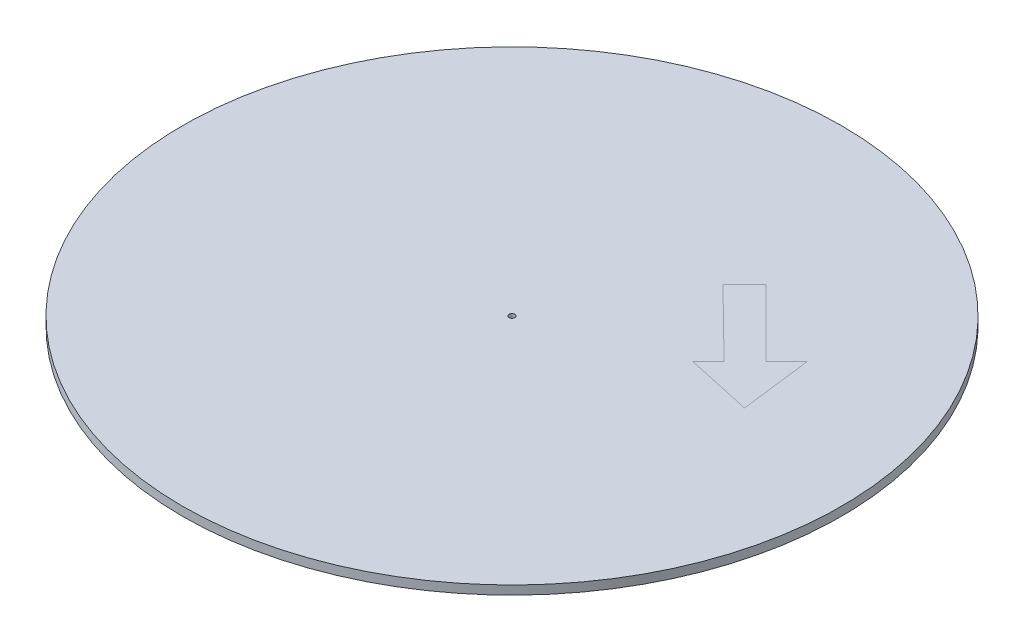
ISO-10303-21;
HEADER;
FILE_DESCRIPTION(('STEP AP214'),'2;1');
FILE_NAME('part.step','',(''),(''),'','','');
FILE_SCHEMA(('AUTOMOTIVE_DESIGN { 1 0 10303 214 1 1 1 1 }'));
ENDSEC;
DATA;
#1=APPLICATION_CONTEXT('core data for automotive mechanical design processes');
#2=APPLICATION_PROTOCOL_DEFINITION('international standard','automotive_design',2000,#1);
#3=PRODUCT_CONTEXT('',#1,'mechanical');
#4=PRODUCT('Part','Part','',(#3));
#5=PRODUCT_RELATED_PRODUCT_CATEGORY('part','',(#4));
#6=PRODUCT_DEFINITION_FORMATION('','',#4);
#7=PRODUCT_DEFINITION_CONTEXT('part definition',#1,'design');
#8=PRODUCT_DEFINITION('design','',#6,#7);
#9=PRODUCT_DEFINITION_SHAPE('','',#8);
#10=(LENGTH_UNIT() NAMED_UNIT(*) SI_UNIT(.MILLI.,.METRE.));
#11=(NAMED_UNIT(*) PLANE_ANGLE_UNIT() SI_UNIT($,.RADIAN.));
#12=(NAMED_UNIT(*) SI_UNIT($,.STERADIAN.) SOLID_ANGLE_UNIT());
#13=UNCERTAINTY_MEASURE_WITH_UNIT(LENGTH_MEASURE(1.E-05),#10,'distance_accuracy_value','');
#14=(GEOMETRIC_REPRESENTATION_CONTEXT(3) GLOBAL_UNCERTAINTY_ASSIGNED_CONTEXT((#13)) GLOBAL_UNIT_ASSIGNED_CONTEXT((#10,
#11,#12)) REPRESENTATION_CONTEXT('',''));
#15=CARTESIAN_POINT('',(0.,0.,0.));
#16=DIRECTION('',(0.,0.,1.));
#17=DIRECTION('',(1.,0.,0.));
#18=AXIS2_PLACEMENT_3D('',#15,#16,#17);
#19=CARTESIAN_POINT('',(0.,3.,0.));
#20=DIRECTION('',(0.,-1.,0.));
#21=DIRECTION('',(0.,0.,-1.));
#22=AXIS2_PLACEMENT_3D('',#19,#20,#21);
#23=CYLINDRICAL_SURFACE('',#22,112.5);
#24=CARTESIAN_POINT('',(0.,3.,0.));
#25=DIRECTION('',(0.,1.,0.));
#26=DIRECTION('',(0.,0.,1.));
#27=AXIS2_PLACEMENT_3D('',#24,#25,#26);
#28=CIRCLE('',#27,112.5);
#29=CARTESIAN_POINT('',(0.,3.,112.5));
#30=VERTEX_POINT('',#29);
#31=EDGE_CURVE('E11',#30,#30,#28,.T.);
#32=ORIENTED_EDGE('',*,*,#31,.F.);
#33=EDGE_LOOP('',(#32));
#34=FACE_BOUND('',#33,.T.);
#35=CARTESIAN_POINT('',(0.,0.,0.));
#36=DIRECTION('',(0.,1.,0.));
#37=DIRECTION('',(0.,0.,1.));
#38=AXIS2_PLACEMENT_3D('',#35,#36,#37);
#39=CIRCLE('',#38,112.5);
#40=CARTESIAN_POINT('',(0.,0.,112.5));
#41=VERTEX_POINT('',#40);
#42=EDGE_CURVE('E44',#41,#41,#39,.T.);
#43=ORIENTED_EDGE('',*,*,#42,.T.);
#44=EDGE_LOOP('',(#43));
#45=FACE_BOUND('',#44,.T.);
#46=ADVANCED_FACE('F41',(#34,#45),#23,.T.);
#47=CARTESIAN_POINT('',(0.,3.,0.));
#48=DIRECTION('',(0.,1.,0.));
#49=DIRECTION('',(0.,0.,1.));
#50=AXIS2_PLACEMENT_3D('',#47,#48,#49);
#51=PLANE('',#50);
#52=DIRECTION('',(0.713052521380195,0.,0.701110620197231));
#53=VECTOR('',#52,1.);
#54=CARTESIAN_POINT('',(49.612104378925,3.,-22.7841036337028));
#55=LINE('',#54,#53);
#56=CARTESIAN_POINT('',(26.6711118519753,3.,-45.3408901483581));
#57=VERTEX_POINT('',#56);
#58=CARTESIAN_POINT('',(49.612104378925,3.,-22.7841036337028));
#59=VERTEX_POINT('',#58);
#60=EDGE_CURVE('E55',#57,#59,#55,.T.);
#61=ORIENTED_EDGE('',*,*,#60,.F.);
#62=DIRECTION('',(-0.707106781186547,0.,0.707106781186549));
#63=VECTOR('',#62,1.);
#64=CARTESIAN_POINT('',(26.6711118519753,3.,-45.3408901483581));
#65=LINE('',#64,#63);
#66=CARTESIAN_POINT('',(34.0448898345803,3.,-52.714668130963));
#67=VERTEX_POINT('',#66);
#68=EDGE_CURVE('E147',#67,#57,#65,.T.);
#69=ORIENTED_EDGE('',*,*,#68,.F.);
#70=DIRECTION('',(-0.707106781186548,0.,-0.707106781186546));
#71=VECTOR('',#70,1.);
#72=CARTESIAN_POINT('',(34.0448898345803,3.,-52.714668130963));
#73=LINE('',#72,#71);
#74=CARTESIAN_POINT('',(56.7937793553828,3.,-29.9657786101606));
#75=VERTEX_POINT('',#74);
#76=EDGE_CURVE('E145',#75,#67,#73,.T.);
#77=ORIENTED_EDGE('',*,*,#76,.F.);
#78=DIRECTION('',(-0.707106781186547,0.,0.707106781186548));
#79=VECTOR('',#78,1.);
#80=CARTESIAN_POINT('',(56.7937793553828,3.,-29.9657786101606));
#81=LINE('',#80,#79);
#82=CARTESIAN_POINT('',(63.8537795514939,3.,-37.0257788062717));
#83=VERTEX_POINT('',#82);
#84=EDGE_CURVE('E109',#83,#75,#81,.T.);
#85=ORIENTED_EDGE('',*,*,#84,.F.);
#86=DIRECTION('',(-0.12364452531376,0.,-0.992326574953999));
#87=VECTOR('',#86,1.);
#88=CARTESIAN_POINT('',(63.8537795514939,3.,-37.0257788062717));
#89=LINE('',#88,#87);
#90=CARTESIAN_POINT('',(66.9131129698088,3.,-12.4726670131297));
#91=VERTEX_POINT('',#90);
#92=EDGE_CURVE('E141',#91,#83,#89,.T.);
#93=ORIENTED_EDGE('',*,*,#92,.F.);
#94=DIRECTION('',(0.97705415172726,0.,0.212991043456113));
#95=VECTOR('',#94,1.);
#96=CARTESIAN_POINT('',(66.9131129698088,3.,-12.4726670131297));
#97=LINE('',#96,#95);
#98=CARTESIAN_POINT('',(44.2426678956297,3.,-17.4146671504074));
#99=VERTEX_POINT('',#98);
#100=EDGE_CURVE('E138',#99,#91,#97,.T.);
#101=ORIENTED_EDGE('',*,*,#100,.F.);
#102=DIRECTION('',(-0.707106781186547,0.,0.707106781186548));
#103=VECTOR('',#102,1.);
#104=CARTESIAN_POINT('',(44.2426678956297,3.,-17.4146671504074));
#105=LINE('',#104,#103);
#106=EDGE_CURVE('E135',#59,#99,#105,.T.);
#107=ORIENTED_EDGE('',*,*,#106,.F.);
#108=EDGE_LOOP('',(#61,#69,#77,#85,#93,#101,#107));
#109=FACE_BOUND('',#108,.T.);
#110=CARTESIAN_POINT('',(0.,3.,0.));
#111=DIRECTION('',(0.,1.,0.));
#112=DIRECTION('',(0.,0.,1.));
#113=AXIS2_PLACEMENT_3D('',#110,#111,#112);
#114=CIRCLE('',#113,1.);
#115=CARTESIAN_POINT('',(0.,3.,1.));
#116=VERTEX_POINT('',#115);
#117=EDGE_CURVE('E151',#116,#116,#114,.T.);
#118=ORIENTED_EDGE('',*,*,#117,.F.);
#119=EDGE_LOOP('',(#118));
#120=FACE_BOUND('',#119,.T.);
#121=ORIENTED_EDGE('',*,*,#31,.T.);
#122=EDGE_LOOP('',(#121));
#123=FACE_BOUND('',#122,.T.);
#124=ADVANCED_FACE('F172',(#109,#120,#123),#51,.T.);
#125=CARTESIAN_POINT('',(0.,0.,0.));
#126=DIRECTION('',(0.,1.,0.));
#127=DIRECTION('',(0.,0.,1.));
#128=AXIS2_PLACEMENT_3D('',#125,#126,#127);
#129=PLANE('',#128);
#130=CARTESIAN_POINT('',(0.,0.,0.));
#131=DIRECTION('',(0.,1.,0.));
#132=DIRECTION('',(0.,0.,1.));
#133=AXIS2_PLACEMENT_3D('',#130,#131,#132);
#134=CIRCLE('',#133,1.);
#135=CARTESIAN_POINT('',(0.,0.,1.));
#136=VERTEX_POINT('',#135);
#137=EDGE_CURVE('E161',#136,#136,#134,.F.);
#138=ORIENTED_EDGE('',*,*,#137,.F.);
#139=EDGE_LOOP('',(#138));
#140=FACE_BOUND('',#139,.T.);
#141=ORIENTED_EDGE('',*,*,#42,.F.);
#142=EDGE_LOOP('',(#141));
#143=FACE_BOUND('',#142,.T.);
#144=ADVANCED_FACE('F169',(#140,#143),#129,.F.);
#145=CARTESIAN_POINT('',(0.,-0.00100000000000013,0.));
#146=DIRECTION('',(0.,1.,0.));
#147=DIRECTION('',(0.,0.,1.));
#148=AXIS2_PLACEMENT_3D('',#145,#146,#147);
#149=CYLINDRICAL_SURFACE('',#148,1.);
#150=CARTESIAN_POINT('',(0.,3.,1.));
#151=CARTESIAN_POINT('',(0.,2.96875,1.));
#152=CARTESIAN_POINT('',(0.,2.9375,1.));
#153=CARTESIAN_POINT('',(0.,2.875,1.));
#154=CARTESIAN_POINT('',(0.,2.84375,1.));
#155=CARTESIAN_POINT('',(0.,2.78125,1.));
#156=CARTESIAN_POINT('',(0.,2.75,1.));
#157=CARTESIAN_POINT('',(0.,2.6875,1.));
#158=CARTESIAN_POINT('',(0.,2.65625,1.));
#159=CARTESIAN_POINT('',(0.,2.59375,1.));
#160=CARTESIAN_POINT('',(0.,2.5625,1.));
#161=CARTESIAN_POINT('',(0.,2.5,1.));
#162=CARTESIAN_POINT('',(0.,2.46875,1.));
#163=CARTESIAN_POINT('',(0.,2.40625,1.));
#164=CARTESIAN_POINT('',(0.,2.375,1.));
#165=CARTESIAN_POINT('',(0.,2.3125,1.));
#166=CARTESIAN_POINT('',(0.,2.28125,1.));
#167=CARTESIAN_POINT('',(0.,2.21875,1.));
#168=CARTESIAN_POINT('',(0.,2.1875,1.));
#169=CARTESIAN_POINT('',(0.,2.125,1.));
#170=CARTESIAN_POINT('',(0.,2.09375,1.));
#171=CARTESIAN_POINT('',(0.,2.03125,1.));
#172=CARTESIAN_POINT('',(0.,2.,1.));
#173=CARTESIAN_POINT('',(0.,1.9375,1.));
#174=CARTESIAN_POINT('',(0.,1.90625,1.));
#175=CARTESIAN_POINT('',(0.,1.84375,1.));
#176=CARTESIAN_POINT('',(0.,1.8125,1.));
#177=CARTESIAN_POINT('',(0.,1.75,1.));
#178=CARTESIAN_POINT('',(0.,1.71875,1.));
#179=CARTESIAN_POINT('',(0.,1.65625,1.));
#180=CARTESIAN_POINT('',(0.,1.625,1.));
#181=CARTESIAN_POINT('',(0.,1.5625,1.));
#182=CARTESIAN_POINT('',(0.,1.53125,1.));
#183=CARTESIAN_POINT('',(0.,1.46875,1.));
#184=CARTESIAN_POINT('',(0.,1.4375,1.));
#185=CARTESIAN_POINT('',(0.,1.375,1.));
#186=CARTESIAN_POINT('',(0.,1.34375,1.));
#187=CARTESIAN_POINT('',(0.,1.28125,1.));
#188=CARTESIAN_POINT('',(0.,1.25,1.));
#189=CARTESIAN_POINT('',(0.,1.1875,1.));
#190=CARTESIAN_POINT('',(0.,1.15625,1.));
#191=CARTESIAN_POINT('',(0.,1.09375,1.));
#192=CARTESIAN_POINT('',(0.,1.0625,1.));
#193=CARTESIAN_POINT('',(0.,1.,1.));
#194=CARTESIAN_POINT('',(0.,0.96875,1.));
#195=CARTESIAN_POINT('',(0.,0.90625,1.));
#196=CARTESIAN_POINT('',(0.,0.875,1.));
#197=CARTESIAN_POINT('',(0.,0.8125,1.));
#198=CARTESIAN_POINT('',(0.,0.78125,1.));
#199=CARTESIAN_POINT('',(0.,0.71875,1.));
#200=CARTESIAN_POINT('',(0.,0.6875,1.));
#201=CARTESIAN_POINT('',(0.,0.625,1.));
#202=CARTESIAN_POINT('',(0.,0.59375,1.));
#203=CARTESIAN_POINT('',(0.,0.53125,1.));
#204=CARTESIAN_POINT('',(0.,0.5,1.));
#205=CARTESIAN_POINT('',(0.,0.4375,1.));
#206=CARTESIAN_POINT('',(0.,0.40625,1.));
#207=CARTESIAN_POINT('',(0.,0.34375,1.));
#208=CARTESIAN_POINT('',(0.,0.3125,1.));
#209=CARTESIAN_POINT('',(0.,0.25,1.));
#210=CARTESIAN_POINT('',(0.,0.21875,1.));
#211=CARTESIAN_POINT('',(0.,0.15625,1.));
#212=CARTESIAN_POINT('',(0.,0.125,1.));
#213=CARTESIAN_POINT('',(0.,0.0625000000000001,1.));
#214=CARTESIAN_POINT('',(0.,0.0312500000000001,1.));
#215=CARTESIAN_POINT('',(0.,0.,1.));
#216=B_SPLINE_CURVE_WITH_KNOTS('',3,(#150,#151,#152,#153,#154,#155,#156,#157,#158,#159,#160,
#161,#162,#163,#164,#165,#166,#167,#168,#169,#170,#171,#172,#173,#174,#175,#176,#177,#178,#179,
#180,#181,#182,#183,#184,#185,#186,#187,#188,#189,#190,#191,#192,#193,#194,#195,#196,#197,#198,
#199,#200,#201,#202,#203,#204,#205,#206,#207,#208,#209,#210,#211,#212,#213,#214,#215),
.UNSPECIFIED.,.F.,.F.,(4,2,2,2,2,2,2,2,2,2,2,2,2,2,2,2,2,2,2,2,2,2,2,2,2,2,2,2,2,2,2,2,4),(0.,
0.0937500000000001,0.1875,0.28125,0.375,0.46875,0.5625,0.65625,0.75,0.84375,0.9375,1.03125,
1.125,1.21875,1.3125,1.40625,1.5,1.59375,1.6875,1.78125,1.875,1.96875,2.0625,2.15625,2.25,
2.34375,2.4375,2.53125,2.625,2.71875,2.8125,2.90625,3.),.UNSPECIFIED.);
#217=EDGE_CURVE('BSEAM171',#116,#136,#216,.T.);
#218=ORIENTED_EDGE('',*,*,#117,.T.);
#219=ORIENTED_EDGE('',*,*,#137,.T.);
#220=ORIENTED_EDGE('',*,*,#217,.T.);
#221=ORIENTED_EDGE('',*,*,#217,.F.);
#222=EDGE_LOOP('',(#218,#220,#219,#221));
#223=FACE_BOUND('',#222,.T.);
#224=ADVANCED_FACE('F171',(#223),#149,.F.);
#225=CARTESIAN_POINT('',(49.612104378925,2.9,-22.7841036337028));
#226=DIRECTION('',(-0.701110620197231,0.,0.713052521380195));
#227=DIRECTION('',(0.713052521380195,0.,0.701110620197231));
#228=AXIS2_PLACEMENT_3D('',#225,#226,#227);
#229=PLANE('',#228);
#230=ORIENTED_EDGE('',*,*,#60,.T.);
#231=DIRECTION('',(0.,1.,0.));
#232=VECTOR('',#231,1.);
#233=CARTESIAN_POINT('',(49.612104378925,2.9,-22.7841036337028));
#234=LINE('',#233,#232);
#235=CARTESIAN_POINT('',(49.612104378925,2.9,-22.7841036337028));
#236=VERTEX_POINT('',#235);
#237=EDGE_CURVE('E88',#236,#59,#234,.T.);
#238=ORIENTED_EDGE('',*,*,#237,.F.);
#239=DIRECTION('',(0.713052521380195,0.,0.701110620197231));
#240=VECTOR('',#239,1.);
#241=CARTESIAN_POINT('',(49.612104378925,2.9,-22.7841036337028));
#242=LINE('',#241,#240);
#243=CARTESIAN_POINT('',(26.6711118519753,2.9,-45.3408901483581));
#244=VERTEX_POINT('',#243);
#245=EDGE_CURVE('E149',#244,#236,#242,.T.);
#246=ORIENTED_EDGE('',*,*,#245,.F.);
#247=DIRECTION('',(0.,1.,0.));
#248=VECTOR('',#247,1.);
#249=CARTESIAN_POINT('',(26.6711118519753,2.9,-45.3408901483581));
#250=LINE('',#249,#248);
#251=EDGE_CURVE('E63',#244,#57,#250,.T.);
#252=ORIENTED_EDGE('',*,*,#251,.T.);
#253=EDGE_LOOP('',(#230,#238,#246,#252));
#254=FACE_BOUND('',#253,.T.);
#255=ADVANCED_FACE('F178',(#254),#229,.F.);
#256=CARTESIAN_POINT('',(26.6711118519753,2.9,-45.3408901483581));
#257=DIRECTION('',(-0.707106781186548,0.,-0.707106781186546));
#258=DIRECTION('',(-0.707106781186547,0.,0.707106781186549));
#259=AXIS2_PLACEMENT_3D('',#256,#257,#258);
#260=PLANE('',#259);
#261=ORIENTED_EDGE('',*,*,#68,.T.);
#262=ORIENTED_EDGE('',*,*,#251,.F.);
#263=DIRECTION('',(-0.707106781186547,0.,0.707106781186549));
#264=VECTOR('',#263,1.);
#265=CARTESIAN_POINT('',(26.6711118519753,2.9,-45.3408901483581));
#266=LINE('',#265,#264);
#267=CARTESIAN_POINT('',(34.0448898345803,2.9,-52.714668130963));
#268=VERTEX_POINT('',#267);
#269=EDGE_CURVE('E121',#268,#244,#266,.T.);
#270=ORIENTED_EDGE('',*,*,#269,.F.);
#271=DIRECTION('',(0.,1.,0.));
#272=VECTOR('',#271,1.);
#273=CARTESIAN_POINT('',(34.0448898345803,2.9,-52.714668130963));
#274=LINE('',#273,#272);
#275=EDGE_CURVE('E113',#268,#67,#274,.T.);
#276=ORIENTED_EDGE('',*,*,#275,.T.);
#277=EDGE_LOOP('',(#261,#262,#270,#276));
#278=FACE_BOUND('',#277,.T.);
#279=ADVANCED_FACE('F206',(#278),#260,.F.);
#280=CARTESIAN_POINT('',(34.0448898345803,2.9,-52.714668130963));
#281=DIRECTION('',(0.707106781186546,0.,-0.707106781186548));
#282=DIRECTION('',(-0.707106781186549,0.,-0.707106781186547));
#283=AXIS2_PLACEMENT_3D('',#280,#281,#282);
#284=PLANE('',#283);
#285=ORIENTED_EDGE('',*,*,#76,.T.);
#286=ORIENTED_EDGE('',*,*,#275,.F.);
#287=DIRECTION('',(-0.707106781186548,0.,-0.707106781186546));
#288=VECTOR('',#287,1.);
#289=CARTESIAN_POINT('',(34.0448898345803,2.9,-52.714668130963));
#290=LINE('',#289,#288);
#291=CARTESIAN_POINT('',(56.7937793553828,2.9,-29.9657786101606));
#292=VERTEX_POINT('',#291);
#293=EDGE_CURVE('E117',#292,#268,#290,.T.);
#294=ORIENTED_EDGE('',*,*,#293,.F.);
#295=DIRECTION('',(0.,1.,0.));
#296=VECTOR('',#295,1.);
#297=CARTESIAN_POINT('',(56.7937793553828,2.9,-29.9657786101606));
#298=LINE('',#297,#296);
#299=EDGE_CURVE('E102',#292,#75,#298,.T.);
#300=ORIENTED_EDGE('',*,*,#299,.T.);
#301=EDGE_LOOP('',(#285,#286,#294,#300));
#302=FACE_BOUND('',#301,.T.);
#303=ADVANCED_FACE('F118',(#302),#284,.F.);
#304=CARTESIAN_POINT('',(56.7937793553828,2.9,-29.9657786101606));
#305=DIRECTION('',(-0.707106781186548,0.,-0.707106781186547));
#306=DIRECTION('',(-0.707106781186547,0.,0.707106781186548));
#307=AXIS2_PLACEMENT_3D('',#304,#305,#306);
#308=PLANE('',#307);
#309=ORIENTED_EDGE('',*,*,#84,.T.);
#310=ORIENTED_EDGE('',*,*,#299,.F.);
#311=DIRECTION('',(-0.707106781186547,0.,0.707106781186548));
#312=VECTOR('',#311,1.);
#313=CARTESIAN_POINT('',(56.7937793553828,2.9,-29.9657786101606));
#314=LINE('',#313,#312);
#315=CARTESIAN_POINT('',(63.8537795514939,2.9,-37.0257788062717));
#316=VERTEX_POINT('',#315);
#317=EDGE_CURVE('E106',#316,#292,#314,.T.);
#318=ORIENTED_EDGE('',*,*,#317,.F.);
#319=DIRECTION('',(0.,1.,0.));
#320=VECTOR('',#319,1.);
#321=CARTESIAN_POINT('',(63.8537795514939,2.9,-37.0257788062717));
#322=LINE('',#321,#320);
#323=EDGE_CURVE('E114',#316,#83,#322,.T.);
#324=ORIENTED_EDGE('',*,*,#323,.T.);
#325=EDGE_LOOP('',(#309,#310,#318,#324));
#326=FACE_BOUND('',#325,.T.);
#327=ADVANCED_FACE('F104',(#326),#308,.F.);
#328=CARTESIAN_POINT('',(63.8537795514939,2.9,-37.0257788062717));
#329=DIRECTION('',(0.992326574953999,0.,-0.12364452531376));
#330=DIRECTION('',(-0.12364452531376,0.,-0.992326574953999));
#331=AXIS2_PLACEMENT_3D('',#328,#329,#330);
#332=PLANE('',#331);
#333=ORIENTED_EDGE('',*,*,#92,.T.);
#334=ORIENTED_EDGE('',*,*,#323,.F.);
#335=DIRECTION('',(-0.12364452531376,0.,-0.992326574953999));
#336=VECTOR('',#335,1.);
#337=CARTESIAN_POINT('',(63.8537795514939,2.9,-37.0257788062717));
#338=LINE('',#337,#336);
#339=CARTESIAN_POINT('',(66.9131129698088,2.9,-12.4726670131297));
#340=VERTEX_POINT('',#339);
#341=EDGE_CURVE('E127',#340,#316,#338,.T.);
#342=ORIENTED_EDGE('',*,*,#341,.F.);
#343=DIRECTION('',(0.,1.,0.));
#344=VECTOR('',#343,1.);
#345=CARTESIAN_POINT('',(66.9131129698088,2.9,-12.4726670131297));
#346=LINE('',#345,#344);
#347=EDGE_CURVE('E154',#340,#91,#346,.T.);
#348=ORIENTED_EDGE('',*,*,#347,.T.);
#349=EDGE_LOOP('',(#333,#334,#342,#348));
#350=FACE_BOUND('',#349,.T.);
#351=ADVANCED_FACE('F225',(#350),#332,.F.);
#352=CARTESIAN_POINT('',(66.9131129698088,2.9,-12.4726670131297));
#353=DIRECTION('',(-0.212991043456113,0.,0.97705415172726));
#354=DIRECTION('',(0.977054151727261,0.,0.212991043456113));
#355=AXIS2_PLACEMENT_3D('',#352,#353,#354);
#356=PLANE('',#355);
#357=ORIENTED_EDGE('',*,*,#100,.T.);
#358=ORIENTED_EDGE('',*,*,#347,.F.);
#359=DIRECTION('',(0.97705415172726,0.,0.212991043456113));
#360=VECTOR('',#359,1.);
#361=CARTESIAN_POINT('',(66.9131129698088,2.9,-12.4726670131297));
#362=LINE('',#361,#360);
#363=CARTESIAN_POINT('',(44.2426678956297,2.9,-17.4146671504074));
#364=VERTEX_POINT('',#363);
#365=EDGE_CURVE('E129',#364,#340,#362,.T.);
#366=ORIENTED_EDGE('',*,*,#365,.F.);
#367=DIRECTION('',(0.,1.,0.));
#368=VECTOR('',#367,1.);
#369=CARTESIAN_POINT('',(44.2426678956297,2.9,-17.4146671504074));
#370=LINE('',#369,#368);
#371=EDGE_CURVE('E156',#364,#99,#370,.T.);
#372=ORIENTED_EDGE('',*,*,#371,.T.);
#373=EDGE_LOOP('',(#357,#358,#366,#372));
#374=FACE_BOUND('',#373,.T.);
#375=ADVANCED_FACE('F232',(#374),#356,.F.);
#376=CARTESIAN_POINT('',(44.2426678956297,2.9,-17.4146671504074));
#377=DIRECTION('',(-0.707106781186548,0.,-0.707106781186547));
#378=DIRECTION('',(-0.707106781186547,0.,0.707106781186548));
#379=AXIS2_PLACEMENT_3D('',#376,#377,#378);
#380=PLANE('',#379);
#381=ORIENTED_EDGE('',*,*,#106,.T.);
#382=ORIENTED_EDGE('',*,*,#371,.F.);
#383=DIRECTION('',(-0.707106781186547,0.,0.707106781186548));
#384=VECTOR('',#383,1.);
#385=CARTESIAN_POINT('',(44.2426678956297,2.9,-17.4146671504074));
#386=LINE('',#385,#384);
#387=EDGE_CURVE('E262',#236,#364,#386,.T.);
#388=ORIENTED_EDGE('',*,*,#387,.F.);
#389=ORIENTED_EDGE('',*,*,#237,.T.);
#390=EDGE_LOOP('',(#381,#382,#388,#389));
#391=FACE_BOUND('',#390,.T.);
#392=ADVANCED_FACE('F240',(#391),#380,.F.);
#393=CARTESIAN_POINT('',(0.,2.9,0.));
#394=DIRECTION('',(0.,-1.,0.));
#395=DIRECTION('',(0.,0.,-1.));
#396=AXIS2_PLACEMENT_3D('',#393,#394,#395);
#397=PLANE('',#396);
#398=ORIENTED_EDGE('',*,*,#245,.T.);
#399=ORIENTED_EDGE('',*,*,#387,.T.);
#400=ORIENTED_EDGE('',*,*,#365,.T.);
#401=ORIENTED_EDGE('',*,*,#341,.T.);
#402=ORIENTED_EDGE('',*,*,#317,.T.);
#403=ORIENTED_EDGE('',*,*,#293,.T.);
#404=ORIENTED_EDGE('',*,*,#269,.T.);
#405=EDGE_LOOP('',(#398,#399,#400,#401,#402,#403,#404));
#406=FACE_BOUND('',#405,.T.);
#407=ADVANCED_FACE('F124',(#406),#397,.F.);
#408=CLOSED_SHELL('',(#46,#124,#144,#224,#255,#279,#303,#327,#351,#375,#392,#407));
#409=MANIFOLD_SOLID_BREP('B2',#408);
#410=ADVANCED_BREP_SHAPE_REPRESENTATION('',(#18,#409),#14);
#411=SHAPE_DEFINITION_REPRESENTATION(#9,#410);
ENDSEC;
END-ISO-10303-21;
